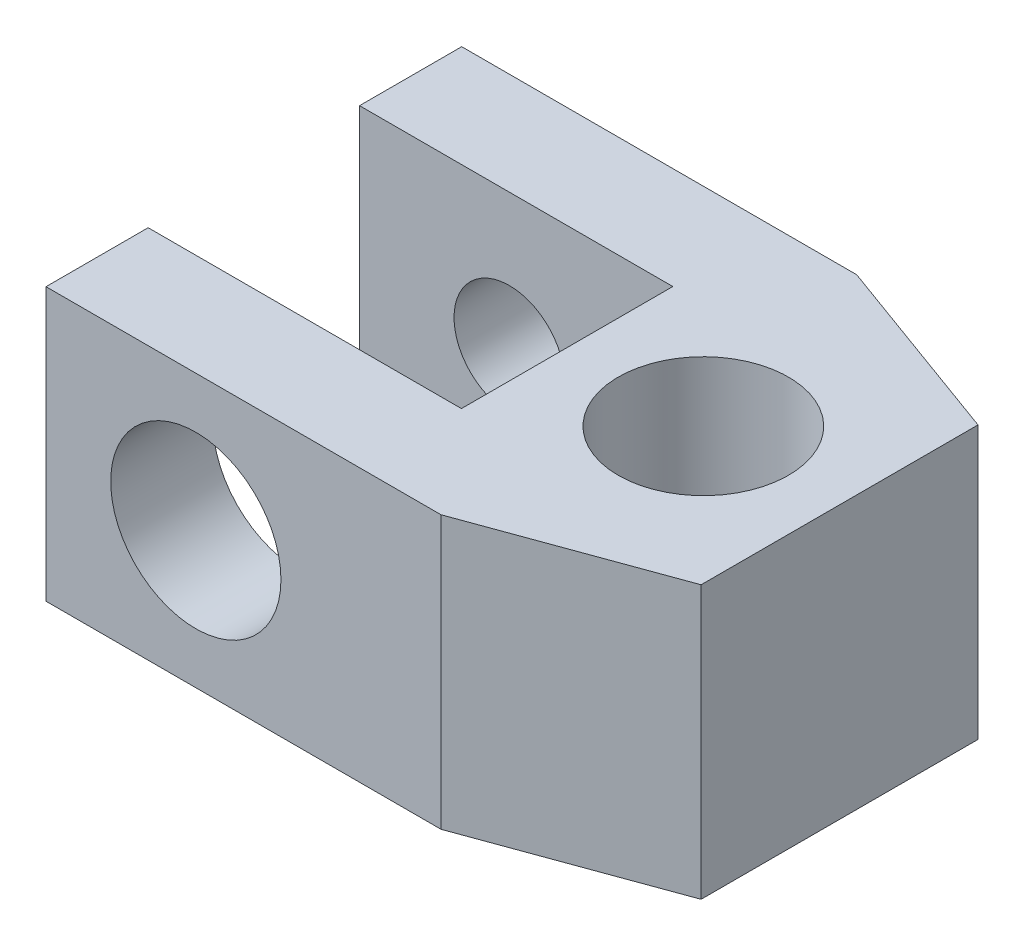
ISO-10303-21;
HEADER;
FILE_DESCRIPTION(('STEP AP214'),'2;1');
FILE_NAME('part.step','',(''),(''),'','','');
FILE_SCHEMA(('AUTOMOTIVE_DESIGN { 1 0 10303 214 1 1 1 1 }'));
ENDSEC;
DATA;
#1=APPLICATION_CONTEXT('core data for automotive mechanical design processes');
#2=APPLICATION_PROTOCOL_DEFINITION('international standard','automotive_design',2000,#1);
#3=PRODUCT_CONTEXT('',#1,'mechanical');
#4=PRODUCT('Part','Part','',(#3));
#5=PRODUCT_RELATED_PRODUCT_CATEGORY('part','',(#4));
#6=PRODUCT_DEFINITION_FORMATION('','',#4);
#7=PRODUCT_DEFINITION_CONTEXT('part definition',#1,'design');
#8=PRODUCT_DEFINITION('design','',#6,#7);
#9=PRODUCT_DEFINITION_SHAPE('','',#8);
#10=(LENGTH_UNIT() NAMED_UNIT(*) SI_UNIT(.MILLI.,.METRE.));
#11=(NAMED_UNIT(*) PLANE_ANGLE_UNIT() SI_UNIT($,.RADIAN.));
#12=(NAMED_UNIT(*) SI_UNIT($,.STERADIAN.) SOLID_ANGLE_UNIT());
#13=UNCERTAINTY_MEASURE_WITH_UNIT(LENGTH_MEASURE(1.E-05),#10,'distance_accuracy_value','');
#14=(GEOMETRIC_REPRESENTATION_CONTEXT(3) GLOBAL_UNCERTAINTY_ASSIGNED_CONTEXT((#13)) GLOBAL_UNIT_ASSIGNED_CONTEXT((#10,
#11,#12)) REPRESENTATION_CONTEXT('',''));
#15=CARTESIAN_POINT('',(0.,0.,0.));
#16=DIRECTION('',(0.,0.,1.));
#17=DIRECTION('',(1.,0.,0.));
#18=AXIS2_PLACEMENT_3D('',#15,#16,#17);
#19=CARTESIAN_POINT('',(0.,12.7,0.));
#20=DIRECTION('',(0.,1.,0.));
#21=DIRECTION('',(0.,0.,1.));
#22=AXIS2_PLACEMENT_3D('',#19,#20,#21);
#23=PLANE('',#22);
#24=DIRECTION('',(0.,0.,-1.));
#25=VECTOR('',#24,1.);
#26=CARTESIAN_POINT('',(27.305,12.7,0.));
#27=LINE('',#26,#25);
#28=CARTESIAN_POINT('',(27.305,12.7,-3.23569538262654));
#29=VERTEX_POINT('',#28);
#30=CARTESIAN_POINT('',(27.305,12.7,-16.1445046173735));
#31=VERTEX_POINT('',#30);
#32=EDGE_CURVE('E119',#29,#31,#27,.T.);
#33=ORIENTED_EDGE('',*,*,#32,.T.);
#34=DIRECTION('',(0.93969262078591,0.,0.342020143325666));
#35=VECTOR('',#34,1.);
#36=CARTESIAN_POINT('',(8.38282200660545,12.7,-23.031614174456));
#37=LINE('',#36,#35);
#38=CARTESIAN_POINT('',(18.4149999999999,12.7,-19.3802));
#39=VERTEX_POINT('',#38);
#40=EDGE_CURVE('E43',#31,#39,#37,.F.);
#41=ORIENTED_EDGE('',*,*,#40,.T.);
#42=DIRECTION('',(-1.,0.,0.));
#43=VECTOR('',#42,1.);
#44=CARTESIAN_POINT('',(27.305,12.7,-19.3802));
#45=LINE('',#44,#43);
#46=CARTESIAN_POINT('',(0.,12.7,-19.3802));
#47=VERTEX_POINT('',#46);
#48=EDGE_CURVE('E155',#39,#47,#45,.T.);
#49=ORIENTED_EDGE('',*,*,#48,.T.);
#50=DIRECTION('',(0.,0.,1.));
#51=VECTOR('',#50,1.);
#52=CARTESIAN_POINT('',(0.,12.7,-19.3802));
#53=LINE('',#52,#51);
#54=CARTESIAN_POINT('',(0.,12.7,-14.6177));
#55=VERTEX_POINT('',#54);
#56=EDGE_CURVE('E163',#47,#55,#53,.T.);
#57=ORIENTED_EDGE('',*,*,#56,.T.);
#58=DIRECTION('',(1.,0.,0.));
#59=VECTOR('',#58,1.);
#60=CARTESIAN_POINT('',(0.,12.7,-14.6177));
#61=LINE('',#60,#59);
#62=CARTESIAN_POINT('',(14.605,12.7,-14.6177));
#63=VERTEX_POINT('',#62);
#64=EDGE_CURVE('E202',#55,#63,#61,.T.);
#65=ORIENTED_EDGE('',*,*,#64,.T.);
#66=DIRECTION('',(0.,0.,1.));
#67=VECTOR('',#66,1.);
#68=CARTESIAN_POINT('',(14.605,12.7,-14.6177));
#69=LINE('',#68,#67);
#70=CARTESIAN_POINT('',(14.605,12.7,-4.7625));
#71=VERTEX_POINT('',#70);
#72=EDGE_CURVE('E212',#63,#71,#69,.T.);
#73=ORIENTED_EDGE('',*,*,#72,.T.);
#74=DIRECTION('',(-1.,0.,0.));
#75=VECTOR('',#74,1.);
#76=CARTESIAN_POINT('',(14.605,12.7,-4.7625));
#77=LINE('',#76,#75);
#78=CARTESIAN_POINT('',(0.,12.7,-4.7625));
#79=VERTEX_POINT('',#78);
#80=EDGE_CURVE('E125',#71,#79,#77,.T.);
#81=ORIENTED_EDGE('',*,*,#80,.T.);
#82=DIRECTION('',(0.,0.,1.));
#83=VECTOR('',#82,1.);
#84=CARTESIAN_POINT('',(0.,12.7,-4.7625));
#85=LINE('',#84,#83);
#86=CARTESIAN_POINT('',(0.,12.7,0.));
#87=VERTEX_POINT('',#86);
#88=EDGE_CURVE('E120',#79,#87,#85,.T.);
#89=ORIENTED_EDGE('',*,*,#88,.T.);
#90=DIRECTION('',(1.,0.,0.));
#91=VECTOR('',#90,1.);
#92=CARTESIAN_POINT('',(0.,12.7,0.));
#93=LINE('',#92,#91);
#94=CARTESIAN_POINT('',(18.4149999999999,12.7,0.));
#95=VERTEX_POINT('',#94);
#96=EDGE_CURVE('E111',#87,#95,#93,.T.);
#97=ORIENTED_EDGE('',*,*,#96,.T.);
#98=DIRECTION('',(-0.939692620785909,0.,0.342020143325666));
#99=VECTOR('',#98,1.);
#100=CARTESIAN_POINT('',(2.15414578998197,12.7,5.91846691618874));
#101=LINE('',#100,#99);
#102=EDGE_CURVE('E152',#95,#29,#101,.F.);
#103=ORIENTED_EDGE('',*,*,#102,.T.);
#104=EDGE_LOOP('',(#33,#41,#49,#57,#65,#73,#81,#89,#97,#103));
#105=FACE_BOUND('',#104,.T.);
#106=CARTESIAN_POINT('',(20.955,12.7,-9.6901));
#107=DIRECTION('',(0.,1.,0.));
#108=DIRECTION('',(0.,0.,1.));
#109=AXIS2_PLACEMENT_3D('',#106,#107,#108);
#110=CIRCLE('',#109,3.96875);
#111=CARTESIAN_POINT('',(20.955,12.7,-5.72135));
#112=VERTEX_POINT('',#111);
#113=EDGE_CURVE('E216',#112,#112,#110,.T.);
#114=ORIENTED_EDGE('',*,*,#113,.F.);
#115=EDGE_LOOP('',(#114));
#116=FACE_BOUND('',#115,.T.);
#117=ADVANCED_FACE('F34',(#105,#116),#23,.T.);
#118=CARTESIAN_POINT('',(0.,0.,0.));
#119=DIRECTION('',(0.,1.,0.));
#120=DIRECTION('',(0.,0.,1.));
#121=AXIS2_PLACEMENT_3D('',#118,#119,#120);
#122=PLANE('',#121);
#123=DIRECTION('',(-1.,0.,0.));
#124=VECTOR('',#123,1.);
#125=CARTESIAN_POINT('',(27.305,0.,-19.3802));
#126=LINE('',#125,#124);
#127=CARTESIAN_POINT('',(18.4149999999999,0.,-19.3802));
#128=VERTEX_POINT('',#127);
#129=CARTESIAN_POINT('',(0.,0.,-19.3802));
#130=VERTEX_POINT('',#129);
#131=EDGE_CURVE('E172',#128,#130,#126,.T.);
#132=ORIENTED_EDGE('',*,*,#131,.F.);
#133=DIRECTION('',(-0.93969262078591,0.,-0.342020143325666));
#134=VECTOR('',#133,1.);
#135=CARTESIAN_POINT('',(18.4149999999999,0.,-19.3802));
#136=LINE('',#135,#134);
#137=CARTESIAN_POINT('',(27.305,0.,-16.1445046173735));
#138=VERTEX_POINT('',#137);
#139=EDGE_CURVE('E146',#128,#138,#136,.F.);
#140=ORIENTED_EDGE('',*,*,#139,.T.);
#141=DIRECTION('',(0.,0.,-1.));
#142=VECTOR('',#141,1.);
#143=CARTESIAN_POINT('',(27.305,0.,0.));
#144=LINE('',#143,#142);
#145=CARTESIAN_POINT('',(27.305,0.,-3.23569538262654));
#146=VERTEX_POINT('',#145);
#147=EDGE_CURVE('E170',#146,#138,#144,.T.);
#148=ORIENTED_EDGE('',*,*,#147,.F.);
#149=DIRECTION('',(0.939692620785909,0.,-0.342020143325666));
#150=VECTOR('',#149,1.);
#151=CARTESIAN_POINT('',(27.305,0.,-3.23569538262654));
#152=LINE('',#151,#150);
#153=CARTESIAN_POINT('',(18.4149999999999,0.,0.));
#154=VERTEX_POINT('',#153);
#155=EDGE_CURVE('E138',#146,#154,#152,.F.);
#156=ORIENTED_EDGE('',*,*,#155,.T.);
#157=DIRECTION('',(1.,0.,0.));
#158=VECTOR('',#157,1.);
#159=CARTESIAN_POINT('',(0.,0.,0.));
#160=LINE('',#159,#158);
#161=CARTESIAN_POINT('',(0.,0.,0.));
#162=VERTEX_POINT('',#161);
#163=EDGE_CURVE('E175',#162,#154,#160,.T.);
#164=ORIENTED_EDGE('',*,*,#163,.F.);
#165=DIRECTION('',(0.,0.,1.));
#166=VECTOR('',#165,1.);
#167=CARTESIAN_POINT('',(0.,0.,-4.7625));
#168=LINE('',#167,#166);
#169=CARTESIAN_POINT('',(0.,0.,-4.7625));
#170=VERTEX_POINT('',#169);
#171=EDGE_CURVE('E133',#170,#162,#168,.T.);
#172=ORIENTED_EDGE('',*,*,#171,.F.);
#173=DIRECTION('',(-1.,0.,0.));
#174=VECTOR('',#173,1.);
#175=CARTESIAN_POINT('',(14.605,0.,-4.7625));
#176=LINE('',#175,#174);
#177=CARTESIAN_POINT('',(14.605,0.,-4.7625));
#178=VERTEX_POINT('',#177);
#179=EDGE_CURVE('E129',#178,#170,#176,.T.);
#180=ORIENTED_EDGE('',*,*,#179,.F.);
#181=DIRECTION('',(0.,0.,1.));
#182=VECTOR('',#181,1.);
#183=CARTESIAN_POINT('',(14.605,0.,-14.6177));
#184=LINE('',#183,#182);
#185=CARTESIAN_POINT('',(14.605,0.,-14.6177));
#186=VERTEX_POINT('',#185);
#187=EDGE_CURVE('E185',#186,#178,#184,.T.);
#188=ORIENTED_EDGE('',*,*,#187,.F.);
#189=DIRECTION('',(1.,0.,0.));
#190=VECTOR('',#189,1.);
#191=CARTESIAN_POINT('',(0.,0.,-14.6177));
#192=LINE('',#191,#190);
#193=CARTESIAN_POINT('',(0.,0.,-14.6177));
#194=VERTEX_POINT('',#193);
#195=EDGE_CURVE('E183',#194,#186,#192,.T.);
#196=ORIENTED_EDGE('',*,*,#195,.F.);
#197=DIRECTION('',(0.,0.,1.));
#198=VECTOR('',#197,1.);
#199=CARTESIAN_POINT('',(0.,0.,-19.3802));
#200=LINE('',#199,#198);
#201=EDGE_CURVE('E177',#130,#194,#200,.T.);
#202=ORIENTED_EDGE('',*,*,#201,.F.);
#203=EDGE_LOOP('',(#132,#140,#148,#156,#164,#172,#180,#188,#196,#202));
#204=FACE_BOUND('',#203,.T.);
#205=CARTESIAN_POINT('',(20.955,0.,-9.6901));
#206=DIRECTION('',(0.,1.,0.));
#207=DIRECTION('',(0.,0.,1.));
#208=AXIS2_PLACEMENT_3D('',#205,#206,#207);
#209=CIRCLE('',#208,3.96875);
#210=CARTESIAN_POINT('',(20.955,0.,-5.72135));
#211=VERTEX_POINT('',#210);
#212=EDGE_CURVE('E218',#211,#211,#209,.T.);
#213=ORIENTED_EDGE('',*,*,#212,.T.);
#214=EDGE_LOOP('',(#213));
#215=FACE_BOUND('',#214,.T.);
#216=ADVANCED_FACE('F168',(#204,#215),#122,.F.);
#217=CARTESIAN_POINT('',(0.,12.7,-4.7625));
#218=DIRECTION('',(1.,0.,0.));
#219=DIRECTION('',(0.,0.,-1.));
#220=AXIS2_PLACEMENT_3D('',#217,#218,#219);
#221=PLANE('',#220);
#222=ORIENTED_EDGE('',*,*,#171,.T.);
#223=DIRECTION('',(0.,-1.,0.));
#224=VECTOR('',#223,1.);
#225=CARTESIAN_POINT('',(0.,12.7,0.));
#226=LINE('',#225,#224);
#227=EDGE_CURVE('E115',#87,#162,#226,.T.);
#228=ORIENTED_EDGE('',*,*,#227,.F.);
#229=ORIENTED_EDGE('',*,*,#88,.F.);
#230=DIRECTION('',(0.,-1.,0.));
#231=VECTOR('',#230,1.);
#232=CARTESIAN_POINT('',(0.,12.7,-4.7625));
#233=LINE('',#232,#231);
#234=EDGE_CURVE('E188',#79,#170,#233,.T.);
#235=ORIENTED_EDGE('',*,*,#234,.T.);
#236=EDGE_LOOP('',(#222,#228,#229,#235));
#237=FACE_BOUND('',#236,.T.);
#238=ADVANCED_FACE('F131',(#237),#221,.F.);
#239=CARTESIAN_POINT('',(0.,12.7,0.));
#240=DIRECTION('',(0.,0.,-1.));
#241=DIRECTION('',(-1.,0.,0.));
#242=AXIS2_PLACEMENT_3D('',#239,#240,#241);
#243=PLANE('',#242);
#244=CARTESIAN_POINT('',(6.98499999999999,6.35,0.));
#245=DIRECTION('',(0.,0.,1.));
#246=DIRECTION('',(1.,0.,0.));
#247=AXIS2_PLACEMENT_3D('',#244,#245,#246);
#248=CIRCLE('',#247,3.96875);
#249=CARTESIAN_POINT('',(10.95375,6.35,0.));
#250=VERTEX_POINT('',#249);
#251=EDGE_CURVE('E365',#250,#250,#248,.T.);
#252=ORIENTED_EDGE('',*,*,#251,.F.);
#253=EDGE_LOOP('',(#252));
#254=FACE_BOUND('',#253,.T.);
#255=ORIENTED_EDGE('',*,*,#163,.T.);
#256=DIRECTION('',(0.,1.,0.));
#257=VECTOR('',#256,1.);
#258=CARTESIAN_POINT('',(18.4149999999999,12.7,0.));
#259=LINE('',#258,#257);
#260=EDGE_CURVE('E11',#154,#95,#259,.T.);
#261=ORIENTED_EDGE('',*,*,#260,.T.);
#262=ORIENTED_EDGE('',*,*,#96,.F.);
#263=ORIENTED_EDGE('',*,*,#227,.T.);
#264=EDGE_LOOP('',(#255,#261,#262,#263));
#265=FACE_BOUND('',#264,.T.);
#266=ADVANCED_FACE('F113',(#254,#265),#243,.F.);
#267=CARTESIAN_POINT('',(27.305,12.7,0.));
#268=DIRECTION('',(-1.,0.,0.));
#269=DIRECTION('',(0.,0.,1.));
#270=AXIS2_PLACEMENT_3D('',#267,#268,#269);
#271=PLANE('',#270);
#272=ORIENTED_EDGE('',*,*,#147,.T.);
#273=DIRECTION('',(0.,1.,0.));
#274=VECTOR('',#273,1.);
#275=CARTESIAN_POINT('',(27.305,12.7,-16.1445046173735));
#276=LINE('',#275,#274);
#277=EDGE_CURVE('E56',#138,#31,#276,.T.);
#278=ORIENTED_EDGE('',*,*,#277,.T.);
#279=ORIENTED_EDGE('',*,*,#32,.F.);
#280=DIRECTION('',(0.,-1.,0.));
#281=VECTOR('',#280,1.);
#282=CARTESIAN_POINT('',(27.305,12.7,-3.23569538262654));
#283=LINE('',#282,#281);
#284=EDGE_CURVE('E148',#29,#146,#283,.T.);
#285=ORIENTED_EDGE('',*,*,#284,.T.);
#286=EDGE_LOOP('',(#272,#278,#279,#285));
#287=FACE_BOUND('',#286,.T.);
#288=ADVANCED_FACE('F173',(#287),#271,.F.);
#289=CARTESIAN_POINT('',(27.305,12.7,-19.3802));
#290=DIRECTION('',(0.,0.,1.));
#291=DIRECTION('',(1.,0.,0.));
#292=AXIS2_PLACEMENT_3D('',#289,#290,#291);
#293=PLANE('',#292);
#294=CARTESIAN_POINT('',(6.98499999999999,6.35,-19.3802));
#295=DIRECTION('',(0.,0.,1.));
#296=DIRECTION('',(1.,0.,0.));
#297=AXIS2_PLACEMENT_3D('',#294,#295,#296);
#298=CIRCLE('',#297,2.5796875);
#299=CARTESIAN_POINT('',(9.56468749999999,6.35,-19.3802));
#300=VERTEX_POINT('',#299);
#301=EDGE_CURVE('E367',#300,#300,#298,.T.);
#302=ORIENTED_EDGE('',*,*,#301,.T.);
#303=EDGE_LOOP('',(#302));
#304=FACE_BOUND('',#303,.T.);
#305=ORIENTED_EDGE('',*,*,#48,.F.);
#306=DIRECTION('',(0.,-1.,0.));
#307=VECTOR('',#306,1.);
#308=CARTESIAN_POINT('',(18.4149999999999,12.7,-19.3802));
#309=LINE('',#308,#307);
#310=EDGE_CURVE('E134',#39,#128,#309,.T.);
#311=ORIENTED_EDGE('',*,*,#310,.T.);
#312=ORIENTED_EDGE('',*,*,#131,.T.);
#313=DIRECTION('',(0.,-1.,0.));
#314=VECTOR('',#313,1.);
#315=CARTESIAN_POINT('',(0.,12.7,-19.3802));
#316=LINE('',#315,#314);
#317=EDGE_CURVE('E135',#47,#130,#316,.T.);
#318=ORIENTED_EDGE('',*,*,#317,.F.);
#319=EDGE_LOOP('',(#305,#311,#312,#318));
#320=FACE_BOUND('',#319,.T.);
#321=ADVANCED_FACE('F160',(#304,#320),#293,.F.);
#322=CARTESIAN_POINT('',(0.,12.7,-19.3802));
#323=DIRECTION('',(1.,0.,0.));
#324=DIRECTION('',(0.,0.,-1.));
#325=AXIS2_PLACEMENT_3D('',#322,#323,#324);
#326=PLANE('',#325);
#327=ORIENTED_EDGE('',*,*,#201,.T.);
#328=DIRECTION('',(0.,-1.,0.));
#329=VECTOR('',#328,1.);
#330=CARTESIAN_POINT('',(0.,12.7,-14.6177));
#331=LINE('',#330,#329);
#332=EDGE_CURVE('E141',#55,#194,#331,.T.);
#333=ORIENTED_EDGE('',*,*,#332,.F.);
#334=ORIENTED_EDGE('',*,*,#56,.F.);
#335=ORIENTED_EDGE('',*,*,#317,.T.);
#336=EDGE_LOOP('',(#327,#333,#334,#335));
#337=FACE_BOUND('',#336,.T.);
#338=ADVANCED_FACE('F229',(#337),#326,.F.);
#339=CARTESIAN_POINT('',(0.,12.7,-14.6177));
#340=DIRECTION('',(0.,0.,-1.));
#341=DIRECTION('',(-1.,0.,0.));
#342=AXIS2_PLACEMENT_3D('',#339,#340,#341);
#343=PLANE('',#342);
#344=CARTESIAN_POINT('',(6.98499999999999,6.35,-14.6177));
#345=DIRECTION('',(0.,0.,1.));
#346=DIRECTION('',(1.,0.,0.));
#347=AXIS2_PLACEMENT_3D('',#344,#345,#346);
#348=CIRCLE('',#347,2.5796875);
#349=CARTESIAN_POINT('',(9.56468749999999,6.35,-14.6177));
#350=VERTEX_POINT('',#349);
#351=EDGE_CURVE('E370',#350,#350,#348,.T.);
#352=ORIENTED_EDGE('',*,*,#351,.F.);
#353=EDGE_LOOP('',(#352));
#354=FACE_BOUND('',#353,.T.);
#355=ORIENTED_EDGE('',*,*,#195,.T.);
#356=DIRECTION('',(0.,-1.,0.));
#357=VECTOR('',#356,1.);
#358=CARTESIAN_POINT('',(14.605,12.7,-14.6177));
#359=LINE('',#358,#357);
#360=EDGE_CURVE('E193',#63,#186,#359,.T.);
#361=ORIENTED_EDGE('',*,*,#360,.F.);
#362=ORIENTED_EDGE('',*,*,#64,.F.);
#363=ORIENTED_EDGE('',*,*,#332,.T.);
#364=EDGE_LOOP('',(#355,#361,#362,#363));
#365=FACE_BOUND('',#364,.T.);
#366=ADVANCED_FACE('F200',(#354,#365),#343,.F.);
#367=CARTESIAN_POINT('',(14.605,12.7,-14.6177));
#368=DIRECTION('',(1.,0.,0.));
#369=DIRECTION('',(0.,0.,-1.));
#370=AXIS2_PLACEMENT_3D('',#367,#368,#369);
#371=PLANE('',#370);
#372=ORIENTED_EDGE('',*,*,#187,.T.);
#373=DIRECTION('',(0.,-1.,0.));
#374=VECTOR('',#373,1.);
#375=CARTESIAN_POINT('',(14.605,12.7,-4.7625));
#376=LINE('',#375,#374);
#377=EDGE_CURVE('E190',#71,#178,#376,.T.);
#378=ORIENTED_EDGE('',*,*,#377,.F.);
#379=ORIENTED_EDGE('',*,*,#72,.F.);
#380=ORIENTED_EDGE('',*,*,#360,.T.);
#381=EDGE_LOOP('',(#372,#378,#379,#380));
#382=FACE_BOUND('',#381,.T.);
#383=ADVANCED_FACE('F208',(#382),#371,.F.);
#384=CARTESIAN_POINT('',(14.605,12.7,-4.7625));
#385=DIRECTION('',(0.,0.,1.));
#386=DIRECTION('',(1.,0.,0.));
#387=AXIS2_PLACEMENT_3D('',#384,#385,#386);
#388=PLANE('',#387);
#389=CARTESIAN_POINT('',(6.98499999999999,6.35,-4.7625));
#390=DIRECTION('',(0.,0.,1.));
#391=DIRECTION('',(1.,0.,0.));
#392=AXIS2_PLACEMENT_3D('',#389,#390,#391);
#393=CIRCLE('',#392,3.96875);
#394=CARTESIAN_POINT('',(10.95375,6.35,-4.7625));
#395=VERTEX_POINT('',#394);
#396=EDGE_CURVE('E223',#395,#395,#393,.F.);
#397=ORIENTED_EDGE('',*,*,#396,.F.);
#398=EDGE_LOOP('',(#397));
#399=FACE_BOUND('',#398,.T.);
#400=ORIENTED_EDGE('',*,*,#179,.T.);
#401=ORIENTED_EDGE('',*,*,#234,.F.);
#402=ORIENTED_EDGE('',*,*,#80,.F.);
#403=ORIENTED_EDGE('',*,*,#377,.T.);
#404=EDGE_LOOP('',(#400,#401,#402,#403));
#405=FACE_BOUND('',#404,.T.);
#406=ADVANCED_FACE('F211',(#399,#405),#388,.F.);
#407=CARTESIAN_POINT('',(20.955,12.7,-9.6901));
#408=DIRECTION('',(0.,-1.,0.));
#409=DIRECTION('',(0.,0.,-1.));
#410=AXIS2_PLACEMENT_3D('',#407,#408,#409);
#411=CYLINDRICAL_SURFACE('',#410,3.96875);
#412=ORIENTED_EDGE('',*,*,#113,.T.);
#413=EDGE_LOOP('',(#412));
#414=FACE_BOUND('',#413,.T.);
#415=ORIENTED_EDGE('',*,*,#212,.F.);
#416=EDGE_LOOP('',(#415));
#417=FACE_BOUND('',#416,.T.);
#418=ADVANCED_FACE('F249',(#414,#417),#411,.F.);
#419=CARTESIAN_POINT('',(6.98499999999999,6.35,-15.9878201513365));
#420=DIRECTION('',(0.,0.,1.));
#421=DIRECTION('',(1.,0.,0.));
#422=AXIS2_PLACEMENT_3D('',#419,#420,#421);
#423=CYLINDRICAL_SURFACE('',#422,3.96875);
#424=ORIENTED_EDGE('',*,*,#396,.T.);
#425=EDGE_LOOP('',(#424));
#426=FACE_BOUND('',#425,.T.);
#427=ORIENTED_EDGE('',*,*,#251,.T.);
#428=EDGE_LOOP('',(#427));
#429=FACE_BOUND('',#428,.T.);
#430=ADVANCED_FACE('F271',(#426,#429),#423,.F.);
#431=CARTESIAN_POINT('',(6.98499999999999,6.35,-19.3802));
#432=DIRECTION('',(0.,0.,1.));
#433=DIRECTION('',(1.,0.,0.));
#434=AXIS2_PLACEMENT_3D('',#431,#432,#433);
#435=CYLINDRICAL_SURFACE('',#434,2.5796875);
#436=ORIENTED_EDGE('',*,*,#301,.F.);
#437=EDGE_LOOP('',(#436));
#438=FACE_BOUND('',#437,.T.);
#439=ORIENTED_EDGE('',*,*,#351,.T.);
#440=EDGE_LOOP('',(#439));
#441=FACE_BOUND('',#440,.T.);
#442=ADVANCED_FACE('F276',(#438,#441),#435,.F.);
#443=CARTESIAN_POINT('',(18.4149999999999,12.7,-19.3802));
#444=DIRECTION('',(-0.342020143325666,0.,0.93969262078591));
#445=DIRECTION('',(0.,-1.,0.));
#446=AXIS2_PLACEMENT_3D('',#443,#444,#445);
#447=PLANE('',#446);
#448=ORIENTED_EDGE('',*,*,#40,.F.);
#449=ORIENTED_EDGE('',*,*,#277,.F.);
#450=ORIENTED_EDGE('',*,*,#139,.F.);
#451=ORIENTED_EDGE('',*,*,#310,.F.);
#452=EDGE_LOOP('',(#448,#449,#450,#451));
#453=FACE_BOUND('',#452,.T.);
#454=ADVANCED_FACE('F165',(#453),#447,.F.);
#455=CARTESIAN_POINT('',(27.305,12.7,-3.23569538262654));
#456=DIRECTION('',(-0.342020143325666,0.,-0.939692620785909));
#457=DIRECTION('',(0.,-1.,0.));
#458=AXIS2_PLACEMENT_3D('',#455,#456,#457);
#459=PLANE('',#458);
#460=ORIENTED_EDGE('',*,*,#102,.F.);
#461=ORIENTED_EDGE('',*,*,#260,.F.);
#462=ORIENTED_EDGE('',*,*,#155,.F.);
#463=ORIENTED_EDGE('',*,*,#284,.F.);
#464=EDGE_LOOP('',(#460,#461,#462,#463));
#465=FACE_BOUND('',#464,.T.);
#466=ADVANCED_FACE('F37',(#465),#459,.F.);
#467=CLOSED_SHELL('',(#117,#216,#238,#266,#288,#321,#338,#366,#383,#406,#418,#430,#442,#454,#466));
#468=MANIFOLD_SOLID_BREP('B2',#467);
#469=ADVANCED_BREP_SHAPE_REPRESENTATION('',(#18,#468),#14);
#470=SHAPE_DEFINITION_REPRESENTATION(#9,#469);
ENDSEC;
END-ISO-10303-21;
